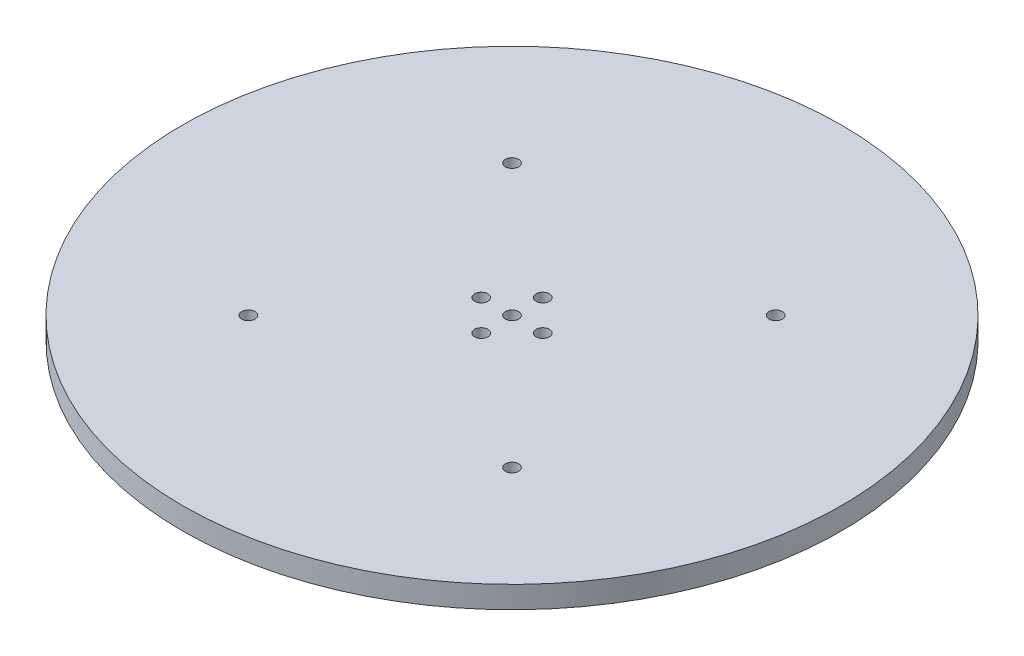
ISO-10303-21;
HEADER;
FILE_DESCRIPTION(('STEP AP214'),'2;1');
FILE_NAME('part.step','',(''),(''),'','','');
FILE_SCHEMA(('AUTOMOTIVE_DESIGN { 1 0 10303 214 1 1 1 1 }'));
ENDSEC;
DATA;
#1=APPLICATION_CONTEXT('core data for automotive mechanical design processes');
#2=APPLICATION_PROTOCOL_DEFINITION('international standard','automotive_design',2000,#1);
#3=PRODUCT_CONTEXT('',#1,'mechanical');
#4=PRODUCT('Part','Part','',(#3));
#5=PRODUCT_RELATED_PRODUCT_CATEGORY('part','',(#4));
#6=PRODUCT_DEFINITION_FORMATION('','',#4);
#7=PRODUCT_DEFINITION_CONTEXT('part definition',#1,'design');
#8=PRODUCT_DEFINITION('design','',#6,#7);
#9=PRODUCT_DEFINITION_SHAPE('','',#8);
#10=(LENGTH_UNIT() NAMED_UNIT(*) SI_UNIT(.MILLI.,.METRE.));
#11=(NAMED_UNIT(*) PLANE_ANGLE_UNIT() SI_UNIT($,.RADIAN.));
#12=(NAMED_UNIT(*) SI_UNIT($,.STERADIAN.) SOLID_ANGLE_UNIT());
#13=UNCERTAINTY_MEASURE_WITH_UNIT(LENGTH_MEASURE(1.E-05),#10,'distance_accuracy_value','');
#14=(GEOMETRIC_REPRESENTATION_CONTEXT(3) GLOBAL_UNCERTAINTY_ASSIGNED_CONTEXT((#13)) GLOBAL_UNIT_ASSIGNED_CONTEXT((#10,
#11,#12)) REPRESENTATION_CONTEXT('',''));
#15=CARTESIAN_POINT('',(0.,0.,0.));
#16=DIRECTION('',(0.,0.,1.));
#17=DIRECTION('',(1.,0.,0.));
#18=AXIS2_PLACEMENT_3D('',#15,#16,#17);
#19=CARTESIAN_POINT('',(0.,5.,0.));
#20=DIRECTION('',(0.,-1.,0.));
#21=DIRECTION('',(0.,0.,-1.));
#22=AXIS2_PLACEMENT_3D('',#19,#20,#21);
#23=CYLINDRICAL_SURFACE('',#22,75.);
#24=CARTESIAN_POINT('',(0.,5.,0.));
#25=DIRECTION('',(0.,1.,0.));
#26=DIRECTION('',(0.,0.,1.));
#27=AXIS2_PLACEMENT_3D('',#24,#25,#26);
#28=CIRCLE('',#27,75.);
#29=CARTESIAN_POINT('',(0.,5.,75.));
#30=VERTEX_POINT('',#29);
#31=EDGE_CURVE('E11',#30,#30,#28,.T.);
#32=ORIENTED_EDGE('',*,*,#31,.F.);
#33=EDGE_LOOP('',(#32));
#34=FACE_BOUND('',#33,.T.);
#35=CARTESIAN_POINT('',(0.,0.,0.));
#36=DIRECTION('',(0.,1.,0.));
#37=DIRECTION('',(0.,0.,1.));
#38=AXIS2_PLACEMENT_3D('',#35,#36,#37);
#39=CIRCLE('',#38,75.);
#40=CARTESIAN_POINT('',(0.,0.,75.));
#41=VERTEX_POINT('',#40);
#42=EDGE_CURVE('E39',#41,#41,#39,.T.);
#43=ORIENTED_EDGE('',*,*,#42,.T.);
#44=EDGE_LOOP('',(#43));
#45=FACE_BOUND('',#44,.T.);
#46=ADVANCED_FACE('F36',(#34,#45),#23,.T.);
#47=CARTESIAN_POINT('',(0.,5.,0.));
#48=DIRECTION('',(0.,1.,0.));
#49=DIRECTION('',(0.,0.,1.));
#50=AXIS2_PLACEMENT_3D('',#47,#48,#49);
#51=PLANE('',#50);
#52=CARTESIAN_POINT('',(-30.,5.,-30.));
#53=DIRECTION('',(0.,1.,0.));
#54=DIRECTION('',(0.,0.,1.));
#55=AXIS2_PLACEMENT_3D('',#52,#53,#54);
#56=CIRCLE('',#55,1.5);
#57=CARTESIAN_POINT('',(-30.,5.,-28.5));
#58=VERTEX_POINT('',#57);
#59=EDGE_CURVE('E87',#58,#58,#56,.T.);
#60=ORIENTED_EDGE('',*,*,#59,.F.);
#61=EDGE_LOOP('',(#60));
#62=FACE_BOUND('',#61,.T.);
#63=CARTESIAN_POINT('',(30.,5.,30.));
#64=DIRECTION('',(0.,1.,0.));
#65=DIRECTION('',(0.,0.,1.));
#66=AXIS2_PLACEMENT_3D('',#63,#64,#65);
#67=CIRCLE('',#66,1.5);
#68=CARTESIAN_POINT('',(30.,5.,31.5));
#69=VERTEX_POINT('',#68);
#70=EDGE_CURVE('E93',#69,#69,#67,.T.);
#71=ORIENTED_EDGE('',*,*,#70,.F.);
#72=EDGE_LOOP('',(#71));
#73=FACE_BOUND('',#72,.T.);
#74=CARTESIAN_POINT('',(-30.,5.,30.));
#75=DIRECTION('',(0.,1.,0.));
#76=DIRECTION('',(0.,0.,1.));
#77=AXIS2_PLACEMENT_3D('',#74,#75,#76);
#78=CIRCLE('',#77,1.5);
#79=CARTESIAN_POINT('',(-30.,5.,31.5));
#80=VERTEX_POINT('',#79);
#81=EDGE_CURVE('E81',#80,#80,#78,.T.);
#82=ORIENTED_EDGE('',*,*,#81,.F.);
#83=EDGE_LOOP('',(#82));
#84=FACE_BOUND('',#83,.T.);
#85=CARTESIAN_POINT('',(30.,5.,-30.));
#86=DIRECTION('',(0.,1.,0.));
#87=DIRECTION('',(0.,0.,1.));
#88=AXIS2_PLACEMENT_3D('',#85,#86,#87);
#89=CIRCLE('',#88,1.5);
#90=CARTESIAN_POINT('',(30.,5.,-28.5));
#91=VERTEX_POINT('',#90);
#92=EDGE_CURVE('E78',#91,#91,#89,.T.);
#93=ORIENTED_EDGE('',*,*,#92,.F.);
#94=EDGE_LOOP('',(#93));
#95=FACE_BOUND('',#94,.T.);
#96=CARTESIAN_POINT('',(-7.,5.,0.));
#97=DIRECTION('',(0.,1.,0.));
#98=DIRECTION('',(0.,0.,1.));
#99=AXIS2_PLACEMENT_3D('',#96,#97,#98);
#100=CIRCLE('',#99,1.5);
#101=CARTESIAN_POINT('',(-7.,5.,1.5));
#102=VERTEX_POINT('',#101);
#103=EDGE_CURVE('E61',#102,#102,#100,.T.);
#104=ORIENTED_EDGE('',*,*,#103,.F.);
#105=EDGE_LOOP('',(#104));
#106=FACE_BOUND('',#105,.T.);
#107=CARTESIAN_POINT('',(0.,5.,7.));
#108=DIRECTION('',(0.,1.,0.));
#109=DIRECTION('',(0.,0.,1.));
#110=AXIS2_PLACEMENT_3D('',#107,#108,#109);
#111=CIRCLE('',#110,1.5);
#112=CARTESIAN_POINT('',(0.,5.,8.5));
#113=VERTEX_POINT('',#112);
#114=EDGE_CURVE('E62',#113,#113,#111,.T.);
#115=ORIENTED_EDGE('',*,*,#114,.F.);
#116=EDGE_LOOP('',(#115));
#117=FACE_BOUND('',#116,.T.);
#118=CARTESIAN_POINT('',(7.,5.,0.));
#119=DIRECTION('',(0.,1.,0.));
#120=DIRECTION('',(0.,0.,1.));
#121=AXIS2_PLACEMENT_3D('',#118,#119,#120);
#122=CIRCLE('',#121,1.5);
#123=CARTESIAN_POINT('',(7.,5.,1.5));
#124=VERTEX_POINT('',#123);
#125=EDGE_CURVE('E69',#124,#124,#122,.T.);
#126=ORIENTED_EDGE('',*,*,#125,.F.);
#127=EDGE_LOOP('',(#126));
#128=FACE_BOUND('',#127,.T.);
#129=CARTESIAN_POINT('',(0.,5.,0.));
#130=DIRECTION('',(0.,1.,0.));
#131=DIRECTION('',(0.,0.,1.));
#132=AXIS2_PLACEMENT_3D('',#129,#130,#131);
#133=CIRCLE('',#132,1.5);
#134=CARTESIAN_POINT('',(0.,5.,1.5));
#135=VERTEX_POINT('',#134);
#136=EDGE_CURVE('E48',#135,#135,#133,.T.);
#137=ORIENTED_EDGE('',*,*,#136,.F.);
#138=EDGE_LOOP('',(#137));
#139=FACE_BOUND('',#138,.T.);
#140=CARTESIAN_POINT('',(0.,5.,-7.));
#141=DIRECTION('',(0.,1.,0.));
#142=DIRECTION('',(0.,0.,1.));
#143=AXIS2_PLACEMENT_3D('',#140,#141,#142);
#144=CIRCLE('',#143,1.5);
#145=CARTESIAN_POINT('',(0.,5.,-5.5));
#146=VERTEX_POINT('',#145);
#147=EDGE_CURVE('E55',#146,#146,#144,.T.);
#148=ORIENTED_EDGE('',*,*,#147,.F.);
#149=EDGE_LOOP('',(#148));
#150=FACE_BOUND('',#149,.T.);
#151=ORIENTED_EDGE('',*,*,#31,.T.);
#152=EDGE_LOOP('',(#151));
#153=FACE_BOUND('',#152,.T.);
#154=ADVANCED_FACE('F104',(#62,#73,#84,#95,#106,#117,#128,#139,#150,#153),#51,.T.);
#155=CARTESIAN_POINT('',(0.,0.,0.));
#156=DIRECTION('',(0.,1.,0.));
#157=DIRECTION('',(0.,0.,1.));
#158=AXIS2_PLACEMENT_3D('',#155,#156,#157);
#159=PLANE('',#158);
#160=CARTESIAN_POINT('',(-30.,0.,-30.));
#161=DIRECTION('',(0.,1.,0.));
#162=DIRECTION('',(0.,0.,1.));
#163=AXIS2_PLACEMENT_3D('',#160,#161,#162);
#164=CIRCLE('',#163,1.5);
#165=CARTESIAN_POINT('',(-30.,0.,-28.5));
#166=VERTEX_POINT('',#165);
#167=EDGE_CURVE('E84',#166,#166,#164,.T.);
#168=ORIENTED_EDGE('',*,*,#167,.T.);
#169=EDGE_LOOP('',(#168));
#170=FACE_BOUND('',#169,.T.);
#171=CARTESIAN_POINT('',(30.,0.,30.));
#172=DIRECTION('',(0.,1.,0.));
#173=DIRECTION('',(0.,0.,1.));
#174=AXIS2_PLACEMENT_3D('',#171,#172,#173);
#175=CIRCLE('',#174,1.5);
#176=CARTESIAN_POINT('',(30.,0.,31.5));
#177=VERTEX_POINT('',#176);
#178=EDGE_CURVE('E90',#177,#177,#175,.T.);
#179=ORIENTED_EDGE('',*,*,#178,.T.);
#180=EDGE_LOOP('',(#179));
#181=FACE_BOUND('',#180,.T.);
#182=CARTESIAN_POINT('',(-30.,0.,30.));
#183=DIRECTION('',(0.,1.,0.));
#184=DIRECTION('',(0.,0.,1.));
#185=AXIS2_PLACEMENT_3D('',#182,#183,#184);
#186=CIRCLE('',#185,1.5);
#187=CARTESIAN_POINT('',(-30.,0.,31.5));
#188=VERTEX_POINT('',#187);
#189=EDGE_CURVE('E96',#188,#188,#186,.T.);
#190=ORIENTED_EDGE('',*,*,#189,.T.);
#191=EDGE_LOOP('',(#190));
#192=FACE_BOUND('',#191,.T.);
#193=CARTESIAN_POINT('',(30.,0.,-30.));
#194=DIRECTION('',(0.,1.,0.));
#195=DIRECTION('',(0.,0.,1.));
#196=AXIS2_PLACEMENT_3D('',#193,#194,#195);
#197=CIRCLE('',#196,1.5);
#198=CARTESIAN_POINT('',(30.,0.,-28.5));
#199=VERTEX_POINT('',#198);
#200=EDGE_CURVE('E66',#199,#199,#197,.T.);
#201=ORIENTED_EDGE('',*,*,#200,.T.);
#202=EDGE_LOOP('',(#201));
#203=FACE_BOUND('',#202,.T.);
#204=CARTESIAN_POINT('',(-7.,0.,0.));
#205=DIRECTION('',(0.,1.,0.));
#206=DIRECTION('',(0.,0.,1.));
#207=AXIS2_PLACEMENT_3D('',#204,#205,#206);
#208=CIRCLE('',#207,1.5);
#209=CARTESIAN_POINT('',(-7.,0.,1.5));
#210=VERTEX_POINT('',#209);
#211=EDGE_CURVE('E46',#210,#210,#208,.T.);
#212=ORIENTED_EDGE('',*,*,#211,.T.);
#213=EDGE_LOOP('',(#212));
#214=FACE_BOUND('',#213,.T.);
#215=CARTESIAN_POINT('',(0.,0.,7.));
#216=DIRECTION('',(0.,1.,0.));
#217=DIRECTION('',(0.,0.,1.));
#218=AXIS2_PLACEMENT_3D('',#215,#216,#217);
#219=CIRCLE('',#218,1.5);
#220=CARTESIAN_POINT('',(0.,0.,8.5));
#221=VERTEX_POINT('',#220);
#222=EDGE_CURVE('E65',#221,#221,#219,.T.);
#223=ORIENTED_EDGE('',*,*,#222,.T.);
#224=EDGE_LOOP('',(#223));
#225=FACE_BOUND('',#224,.T.);
#226=CARTESIAN_POINT('',(7.,0.,0.));
#227=DIRECTION('',(0.,1.,0.));
#228=DIRECTION('',(0.,0.,1.));
#229=AXIS2_PLACEMENT_3D('',#226,#227,#228);
#230=CIRCLE('',#229,1.5);
#231=CARTESIAN_POINT('',(7.,0.,1.5));
#232=VERTEX_POINT('',#231);
#233=EDGE_CURVE('E52',#232,#232,#230,.T.);
#234=ORIENTED_EDGE('',*,*,#233,.T.);
#235=EDGE_LOOP('',(#234));
#236=FACE_BOUND('',#235,.T.);
#237=CARTESIAN_POINT('',(0.,0.,0.));
#238=DIRECTION('',(0.,1.,0.));
#239=DIRECTION('',(0.,0.,1.));
#240=AXIS2_PLACEMENT_3D('',#237,#238,#239);
#241=CIRCLE('',#240,1.5);
#242=CARTESIAN_POINT('',(0.,0.,1.5));
#243=VERTEX_POINT('',#242);
#244=EDGE_CURVE('E51',#243,#243,#241,.T.);
#245=ORIENTED_EDGE('',*,*,#244,.T.);
#246=EDGE_LOOP('',(#245));
#247=FACE_BOUND('',#246,.T.);
#248=CARTESIAN_POINT('',(0.,0.,-7.));
#249=DIRECTION('',(0.,1.,0.));
#250=DIRECTION('',(0.,0.,1.));
#251=AXIS2_PLACEMENT_3D('',#248,#249,#250);
#252=CIRCLE('',#251,1.5);
#253=CARTESIAN_POINT('',(0.,0.,-5.5));
#254=VERTEX_POINT('',#253);
#255=EDGE_CURVE('E58',#254,#254,#252,.T.);
#256=ORIENTED_EDGE('',*,*,#255,.T.);
#257=EDGE_LOOP('',(#256));
#258=FACE_BOUND('',#257,.T.);
#259=ORIENTED_EDGE('',*,*,#42,.F.);
#260=EDGE_LOOP('',(#259));
#261=FACE_BOUND('',#260,.T.);
#262=ADVANCED_FACE('F107',(#170,#181,#192,#203,#214,#225,#236,#247,#258,#261),#159,.F.);
#263=CARTESIAN_POINT('',(0.,0.,-7.));
#264=DIRECTION('',(0.,1.,0.));
#265=DIRECTION('',(0.,0.,1.));
#266=AXIS2_PLACEMENT_3D('',#263,#264,#265);
#267=CYLINDRICAL_SURFACE('',#266,1.5);
#268=ORIENTED_EDGE('',*,*,#255,.F.);
#269=EDGE_LOOP('',(#268));
#270=FACE_BOUND('',#269,.T.);
#271=ORIENTED_EDGE('',*,*,#147,.T.);
#272=EDGE_LOOP('',(#271));
#273=FACE_BOUND('',#272,.T.);
#274=ADVANCED_FACE('F122',(#270,#273),#267,.F.);
#275=CARTESIAN_POINT('',(0.,0.,0.));
#276=DIRECTION('',(0.,1.,0.));
#277=DIRECTION('',(0.,0.,1.));
#278=AXIS2_PLACEMENT_3D('',#275,#276,#277);
#279=CYLINDRICAL_SURFACE('',#278,1.5);
#280=ORIENTED_EDGE('',*,*,#244,.F.);
#281=EDGE_LOOP('',(#280));
#282=FACE_BOUND('',#281,.T.);
#283=ORIENTED_EDGE('',*,*,#136,.T.);
#284=EDGE_LOOP('',(#283));
#285=FACE_BOUND('',#284,.T.);
#286=ADVANCED_FACE('F124',(#282,#285),#279,.F.);
#287=CARTESIAN_POINT('',(7.,0.,0.));
#288=DIRECTION('',(0.,1.,0.));
#289=DIRECTION('',(0.,0.,1.));
#290=AXIS2_PLACEMENT_3D('',#287,#288,#289);
#291=CYLINDRICAL_SURFACE('',#290,1.5);
#292=ORIENTED_EDGE('',*,*,#233,.F.);
#293=EDGE_LOOP('',(#292));
#294=FACE_BOUND('',#293,.T.);
#295=ORIENTED_EDGE('',*,*,#125,.T.);
#296=EDGE_LOOP('',(#295));
#297=FACE_BOUND('',#296,.T.);
#298=ADVANCED_FACE('F131',(#294,#297),#291,.F.);
#299=CARTESIAN_POINT('',(0.,0.,7.));
#300=DIRECTION('',(0.,1.,0.));
#301=DIRECTION('',(0.,0.,1.));
#302=AXIS2_PLACEMENT_3D('',#299,#300,#301);
#303=CYLINDRICAL_SURFACE('',#302,1.5);
#304=ORIENTED_EDGE('',*,*,#222,.F.);
#305=EDGE_LOOP('',(#304));
#306=FACE_BOUND('',#305,.T.);
#307=ORIENTED_EDGE('',*,*,#114,.T.);
#308=EDGE_LOOP('',(#307));
#309=FACE_BOUND('',#308,.T.);
#310=ADVANCED_FACE('F204',(#306,#309),#303,.F.);
#311=CARTESIAN_POINT('',(-7.,0.,0.));
#312=DIRECTION('',(0.,1.,0.));
#313=DIRECTION('',(0.,0.,1.));
#314=AXIS2_PLACEMENT_3D('',#311,#312,#313);
#315=CYLINDRICAL_SURFACE('',#314,1.5);
#316=ORIENTED_EDGE('',*,*,#211,.F.);
#317=EDGE_LOOP('',(#316));
#318=FACE_BOUND('',#317,.T.);
#319=ORIENTED_EDGE('',*,*,#103,.T.);
#320=EDGE_LOOP('',(#319));
#321=FACE_BOUND('',#320,.T.);
#322=ADVANCED_FACE('F164',(#318,#321),#315,.F.);
#323=CARTESIAN_POINT('',(30.,0.,-30.));
#324=DIRECTION('',(0.,1.,0.));
#325=DIRECTION('',(0.,0.,1.));
#326=AXIS2_PLACEMENT_3D('',#323,#324,#325);
#327=CYLINDRICAL_SURFACE('',#326,1.5);
#328=ORIENTED_EDGE('',*,*,#200,.F.);
#329=EDGE_LOOP('',(#328));
#330=FACE_BOUND('',#329,.T.);
#331=ORIENTED_EDGE('',*,*,#92,.T.);
#332=EDGE_LOOP('',(#331));
#333=FACE_BOUND('',#332,.T.);
#334=ADVANCED_FACE('F159',(#330,#333),#327,.F.);
#335=CARTESIAN_POINT('',(-30.,0.,30.));
#336=DIRECTION('',(0.,1.,0.));
#337=DIRECTION('',(0.,0.,1.));
#338=AXIS2_PLACEMENT_3D('',#335,#336,#337);
#339=CYLINDRICAL_SURFACE('',#338,1.5);
#340=ORIENTED_EDGE('',*,*,#189,.F.);
#341=EDGE_LOOP('',(#340));
#342=FACE_BOUND('',#341,.T.);
#343=ORIENTED_EDGE('',*,*,#81,.T.);
#344=EDGE_LOOP('',(#343));
#345=FACE_BOUND('',#344,.T.);
#346=ADVANCED_FACE('F102',(#342,#345),#339,.F.);
#347=CARTESIAN_POINT('',(30.,0.,30.));
#348=DIRECTION('',(0.,1.,0.));
#349=DIRECTION('',(0.,0.,1.));
#350=AXIS2_PLACEMENT_3D('',#347,#348,#349);
#351=CYLINDRICAL_SURFACE('',#350,1.5);
#352=ORIENTED_EDGE('',*,*,#178,.F.);
#353=EDGE_LOOP('',(#352));
#354=FACE_BOUND('',#353,.T.);
#355=ORIENTED_EDGE('',*,*,#70,.T.);
#356=EDGE_LOOP('',(#355));
#357=FACE_BOUND('',#356,.T.);
#358=ADVANCED_FACE('F176',(#354,#357),#351,.F.);
#359=CARTESIAN_POINT('',(-30.,0.,-30.));
#360=DIRECTION('',(0.,1.,0.));
#361=DIRECTION('',(0.,0.,1.));
#362=AXIS2_PLACEMENT_3D('',#359,#360,#361);
#363=CYLINDRICAL_SURFACE('',#362,1.5);
#364=ORIENTED_EDGE('',*,*,#167,.F.);
#365=EDGE_LOOP('',(#364));
#366=FACE_BOUND('',#365,.T.);
#367=ORIENTED_EDGE('',*,*,#59,.T.);
#368=EDGE_LOOP('',(#367));
#369=FACE_BOUND('',#368,.T.);
#370=ADVANCED_FACE('F186',(#366,#369),#363,.F.);
#371=CLOSED_SHELL('',(#46,#154,#262,#274,#286,#298,#310,#322,#334,#346,#358,#370));
#372=MANIFOLD_SOLID_BREP('B2',#371);
#373=ADVANCED_BREP_SHAPE_REPRESENTATION('',(#18,#372),#14);
#374=SHAPE_DEFINITION_REPRESENTATION(#9,#373);
ENDSEC;
END-ISO-10303-21;
